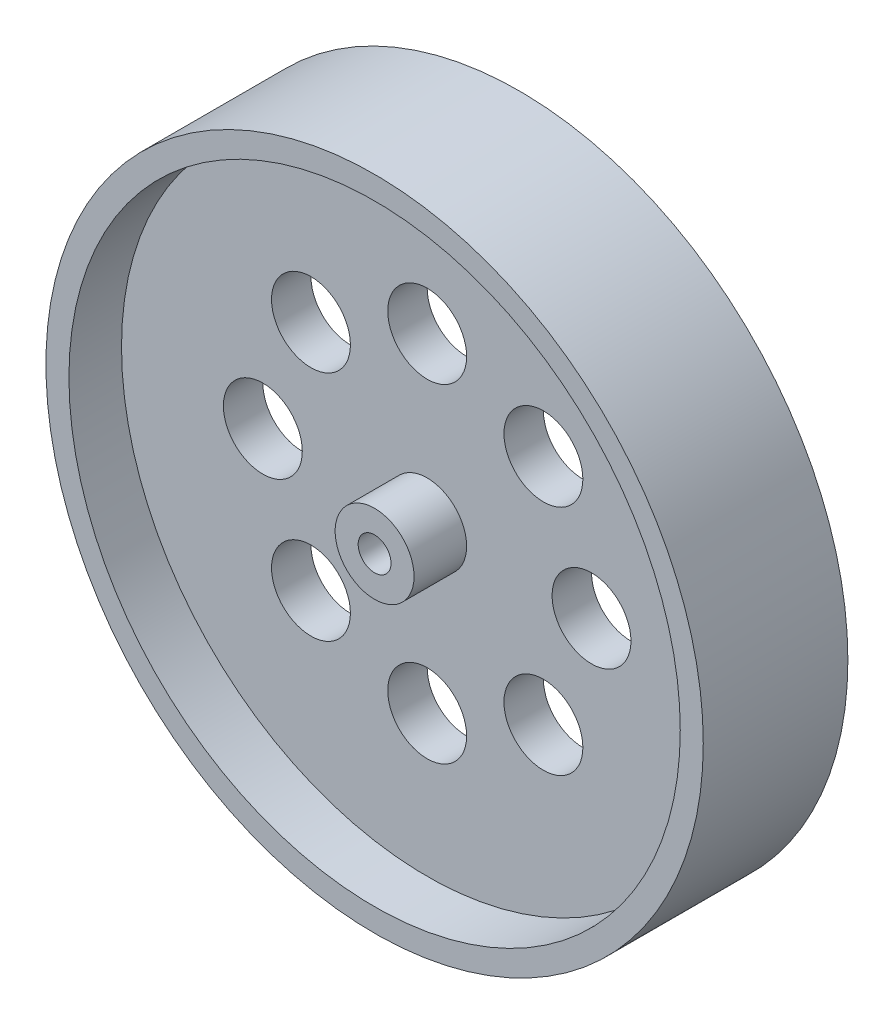
ISO-10303-21;
HEADER;
FILE_DESCRIPTION(('STEP AP214'),'2;1');
FILE_NAME('part.step','',(''),(''),'','','');
FILE_SCHEMA(('AUTOMOTIVE_DESIGN { 1 0 10303 214 1 1 1 1 }'));
ENDSEC;
DATA;
#1=APPLICATION_CONTEXT('core data for automotive mechanical design processes');
#2=APPLICATION_PROTOCOL_DEFINITION('international standard','automotive_design',2000,#1);
#3=PRODUCT_CONTEXT('',#1,'mechanical');
#4=PRODUCT('Part','Part','',(#3));
#5=PRODUCT_RELATED_PRODUCT_CATEGORY('part','',(#4));
#6=PRODUCT_DEFINITION_FORMATION('','',#4);
#7=PRODUCT_DEFINITION_CONTEXT('part definition',#1,'design');
#8=PRODUCT_DEFINITION('design','',#6,#7);
#9=PRODUCT_DEFINITION_SHAPE('','',#8);
#10=(LENGTH_UNIT() NAMED_UNIT(*) SI_UNIT(.MILLI.,.METRE.));
#11=(NAMED_UNIT(*) PLANE_ANGLE_UNIT() SI_UNIT($,.RADIAN.));
#12=(NAMED_UNIT(*) SI_UNIT($,.STERADIAN.) SOLID_ANGLE_UNIT());
#13=UNCERTAINTY_MEASURE_WITH_UNIT(LENGTH_MEASURE(1.E-05),#10,'distance_accuracy_value','');
#14=(GEOMETRIC_REPRESENTATION_CONTEXT(3) GLOBAL_UNCERTAINTY_ASSIGNED_CONTEXT((#13)) GLOBAL_UNIT_ASSIGNED_CONTEXT((#10,
#11,#12)) REPRESENTATION_CONTEXT('',''));
#15=CARTESIAN_POINT('',(0.,0.,0.));
#16=DIRECTION('',(0.,0.,1.));
#17=DIRECTION('',(1.,0.,0.));
#18=AXIS2_PLACEMENT_3D('',#15,#16,#17);
#19=CARTESIAN_POINT('',(0.,0.,22.));
#20=DIRECTION('',(0.,0.,1.));
#21=DIRECTION('',(1.,0.,0.));
#22=AXIS2_PLACEMENT_3D('',#19,#20,#21);
#23=PLANE('',#22);
#24=CARTESIAN_POINT('',(0.,0.,22.));
#25=DIRECTION('',(0.,0.,1.));
#26=DIRECTION('',(1.,0.,0.));
#27=AXIS2_PLACEMENT_3D('',#24,#25,#26);
#28=CIRCLE('',#27,2.5);
#29=CARTESIAN_POINT('',(2.5,0.,22.));
#30=VERTEX_POINT('',#29);
#31=EDGE_CURVE('E67',#30,#30,#28,.T.);
#32=ORIENTED_EDGE('',*,*,#31,.F.);
#33=EDGE_LOOP('',(#32));
#34=FACE_BOUND('',#33,.T.);
#35=CARTESIAN_POINT('',(0.,0.,22.));
#36=DIRECTION('',(0.,0.,1.));
#37=DIRECTION('',(1.,0.,0.));
#38=AXIS2_PLACEMENT_3D('',#35,#36,#37);
#39=CIRCLE('',#38,6.);
#40=CARTESIAN_POINT('',(6.,0.,22.));
#41=VERTEX_POINT('',#40);
#42=EDGE_CURVE('E95',#41,#41,#39,.T.);
#43=ORIENTED_EDGE('',*,*,#42,.T.);
#44=EDGE_LOOP('',(#43));
#45=FACE_BOUND('',#44,.T.);
#46=ADVANCED_FACE('F33',(#34,#45),#23,.T.);
#47=CARTESIAN_POINT('',(0.,0.,0.));
#48=DIRECTION('',(0.,0.,1.));
#49=DIRECTION('',(1.,0.,0.));
#50=AXIS2_PLACEMENT_3D('',#47,#48,#49);
#51=PLANE('',#50);
#52=CARTESIAN_POINT('',(0.,0.,0.));
#53=DIRECTION('',(0.,0.,-1.));
#54=DIRECTION('',(-1.,0.,0.));
#55=AXIS2_PLACEMENT_3D('',#52,#53,#54);
#56=CIRCLE('',#55,2.5);
#57=CARTESIAN_POINT('',(2.49633716473437,-0.135280301470544,0.));
#58=VERTEX_POINT('',#57);
#59=CARTESIAN_POINT('',(1.86981729687922,1.65945270384283,0.));
#60=VERTEX_POINT('',#59);
#61=EDGE_CURVE('E70',#58,#60,#56,.T.);
#62=ORIENTED_EDGE('',*,*,#61,.F.);
#63=DIRECTION('',(0.329583291868416,-0.944126503028688,0.));
#64=VECTOR('',#63,1.);
#65=CARTESIAN_POINT('',(2.1830772308068,0.762086201186142,0.));
#66=LINE('',#65,#64);
#67=EDGE_CURVE('E55',#60,#58,#66,.T.);
#68=ORIENTED_EDGE('',*,*,#67,.F.);
#69=EDGE_LOOP('',(#62,#68));
#70=FACE_BOUND('',#69,.T.);
#71=CARTESIAN_POINT('',(0.,0.,0.));
#72=DIRECTION('',(0.,0.,-1.));
#73=DIRECTION('',(-1.,0.,0.));
#74=AXIS2_PLACEMENT_3D('',#71,#72,#73);
#75=CIRCLE('',#74,6.);
#76=CARTESIAN_POINT('',(-6.,0.,0.));
#77=VERTEX_POINT('',#76);
#78=EDGE_CURVE('E150',#77,#77,#75,.T.);
#79=ORIENTED_EDGE('',*,*,#78,.T.);
#80=EDGE_LOOP('',(#79));
#81=FACE_BOUND('',#80,.T.);
#82=ADVANCED_FACE('F75',(#70,#81),#51,.F.);
#83=CARTESIAN_POINT('',(0.,0.,15.));
#84=DIRECTION('',(0.,0.,1.));
#85=DIRECTION('',(1.,0.,0.));
#86=AXIS2_PLACEMENT_3D('',#83,#84,#85);
#87=PLANE('',#86);
#88=CARTESIAN_POINT('',(0.,0.,15.));
#89=DIRECTION('',(0.,0.,1.));
#90=DIRECTION('',(1.,0.,0.));
#91=AXIS2_PLACEMENT_3D('',#88,#89,#90);
#92=CIRCLE('',#91,2.5);
#93=CARTESIAN_POINT('',(2.49633716473437,-0.135280301470545,15.));
#94=VERTEX_POINT('',#93);
#95=CARTESIAN_POINT('',(1.86981729687922,1.65945270384283,15.));
#96=VERTEX_POINT('',#95);
#97=EDGE_CURVE('E86',#94,#96,#92,.T.);
#98=ORIENTED_EDGE('',*,*,#97,.T.);
#99=DIRECTION('',(0.329583291868416,-0.944126503028688,0.));
#100=VECTOR('',#99,1.);
#101=CARTESIAN_POINT('',(2.1830772308068,0.762086201186142,15.));
#102=LINE('',#101,#100);
#103=EDGE_CURVE('E63',#96,#94,#102,.T.);
#104=ORIENTED_EDGE('',*,*,#103,.T.);
#105=EDGE_LOOP('',(#98,#104));
#106=FACE_BOUND('',#105,.T.);
#107=ADVANCED_FACE('F169',(#106),#87,.T.);
#108=CARTESIAN_POINT('',(0.,0.,22.));
#109=DIRECTION('',(0.,0.,-1.));
#110=DIRECTION('',(-1.,0.,0.));
#111=AXIS2_PLACEMENT_3D('',#108,#109,#110);
#112=CYLINDRICAL_SURFACE('',#111,50.);
#113=CARTESIAN_POINT('',(0.,0.,22.));
#114=DIRECTION('',(0.,0.,1.));
#115=DIRECTION('',(1.,0.,0.));
#116=AXIS2_PLACEMENT_3D('',#113,#114,#115);
#117=CIRCLE('',#116,50.);
#118=CARTESIAN_POINT('',(50.,0.,22.));
#119=VERTEX_POINT('',#118);
#120=EDGE_CURVE('E11',#119,#119,#117,.T.);
#121=ORIENTED_EDGE('',*,*,#120,.F.);
#122=EDGE_LOOP('',(#121));
#123=FACE_BOUND('',#122,.T.);
#124=CARTESIAN_POINT('',(0.,0.,0.));
#125=DIRECTION('',(0.,0.,1.));
#126=DIRECTION('',(1.,0.,0.));
#127=AXIS2_PLACEMENT_3D('',#124,#125,#126);
#128=CIRCLE('',#127,50.);
#129=CARTESIAN_POINT('',(50.,0.,0.));
#130=VERTEX_POINT('',#129);
#131=EDGE_CURVE('E42',#130,#130,#128,.T.);
#132=ORIENTED_EDGE('',*,*,#131,.T.);
#133=EDGE_LOOP('',(#132));
#134=FACE_BOUND('',#133,.T.);
#135=ADVANCED_FACE('F35',(#123,#134),#112,.T.);
#136=CARTESIAN_POINT('',(0.,0.,22.));
#137=DIRECTION('',(0.,0.,1.));
#138=DIRECTION('',(1.,0.,0.));
#139=AXIS2_PLACEMENT_3D('',#136,#137,#138);
#140=CIRCLE('',#139,46.5);
#141=CARTESIAN_POINT('',(46.5,0.,22.));
#142=VERTEX_POINT('',#141);
#143=EDGE_CURVE('E144',#142,#142,#140,.T.);
#144=ORIENTED_EDGE('',*,*,#143,.F.);
#145=EDGE_LOOP('',(#144));
#146=FACE_BOUND('',#145,.T.);
#147=ORIENTED_EDGE('',*,*,#120,.T.);
#148=EDGE_LOOP('',(#147));
#149=FACE_BOUND('',#148,.T.);
#150=ADVANCED_FACE('F165',(#146,#149),#23,.T.);
#151=CARTESIAN_POINT('',(0.,0.,0.));
#152=DIRECTION('',(0.,0.,-1.));
#153=DIRECTION('',(-1.,0.,0.));
#154=AXIS2_PLACEMENT_3D('',#151,#152,#153);
#155=CIRCLE('',#154,46.5);
#156=CARTESIAN_POINT('',(-46.5,0.,0.));
#157=VERTEX_POINT('',#156);
#158=EDGE_CURVE('E80',#157,#157,#155,.T.);
#159=ORIENTED_EDGE('',*,*,#158,.F.);
#160=EDGE_LOOP('',(#159));
#161=FACE_BOUND('',#160,.T.);
#162=ORIENTED_EDGE('',*,*,#131,.F.);
#163=EDGE_LOOP('',(#162));
#164=FACE_BOUND('',#163,.T.);
#165=ADVANCED_FACE('F162',(#161,#164),#51,.F.);
#166=CARTESIAN_POINT('',(0.,0.,15.));
#167=DIRECTION('',(0.,0.,1.));
#168=DIRECTION('',(1.,0.,0.));
#169=AXIS2_PLACEMENT_3D('',#166,#167,#168);
#170=CYLINDRICAL_SURFACE('',#169,2.5);
#171=ORIENTED_EDGE('',*,*,#97,.F.);
#172=DIRECTION('',(0.,0.,-1.));
#173=VECTOR('',#172,1.);
#174=CARTESIAN_POINT('',(2.49633716473437,-0.135280301470544,15.));
#175=LINE('',#174,#173);
#176=EDGE_CURVE('E50',#94,#58,#175,.T.);
#177=ORIENTED_EDGE('',*,*,#176,.T.);
#178=ORIENTED_EDGE('',*,*,#61,.T.);
#179=DIRECTION('',(0.,0.,-1.));
#180=VECTOR('',#179,1.);
#181=CARTESIAN_POINT('',(1.86981729687922,1.65945270384283,15.));
#182=LINE('',#181,#180);
#183=EDGE_CURVE('E60',#96,#60,#182,.T.);
#184=ORIENTED_EDGE('',*,*,#183,.F.);
#185=EDGE_LOOP('',(#171,#177,#178,#184));
#186=FACE_BOUND('',#185,.T.);
#187=ORIENTED_EDGE('',*,*,#31,.T.);
#188=EDGE_LOOP('',(#187));
#189=FACE_BOUND('',#188,.T.);
#190=ADVANCED_FACE('F71',(#186,#189),#170,.F.);
#191=CARTESIAN_POINT('',(2.1830772308068,0.762086201186142,15.));
#192=DIRECTION('',(0.944126503028688,0.329583291868416,0.));
#193=DIRECTION('',(-0.329583291868416,0.944126503028688,0.));
#194=AXIS2_PLACEMENT_3D('',#191,#192,#193);
#195=PLANE('',#194);
#196=ORIENTED_EDGE('',*,*,#67,.T.);
#197=ORIENTED_EDGE('',*,*,#176,.F.);
#198=ORIENTED_EDGE('',*,*,#103,.F.);
#199=ORIENTED_EDGE('',*,*,#183,.T.);
#200=EDGE_LOOP('',(#196,#197,#198,#199));
#201=FACE_BOUND('',#200,.T.);
#202=ADVANCED_FACE('F62',(#201),#195,.F.);
#203=CARTESIAN_POINT('',(0.,0.,8.));
#204=DIRECTION('',(0.,0.,-1.));
#205=DIRECTION('',(-1.,0.,0.));
#206=AXIS2_PLACEMENT_3D('',#203,#204,#205);
#207=CYLINDRICAL_SURFACE('',#206,46.5);
#208=CARTESIAN_POINT('',(0.,0.,8.));
#209=DIRECTION('',(0.,0.,-1.));
#210=DIRECTION('',(-1.,0.,0.));
#211=AXIS2_PLACEMENT_3D('',#208,#209,#210);
#212=CIRCLE('',#211,46.5);
#213=CARTESIAN_POINT('',(-46.5,0.,8.));
#214=VERTEX_POINT('',#213);
#215=EDGE_CURVE('E77',#214,#214,#212,.T.);
#216=ORIENTED_EDGE('',*,*,#215,.F.);
#217=EDGE_LOOP('',(#216));
#218=FACE_BOUND('',#217,.T.);
#219=ORIENTED_EDGE('',*,*,#158,.T.);
#220=EDGE_LOOP('',(#219));
#221=FACE_BOUND('',#220,.T.);
#222=ADVANCED_FACE('F160',(#218,#221),#207,.F.);
#223=CARTESIAN_POINT('',(0.,0.,8.));
#224=DIRECTION('',(0.,0.,-1.));
#225=DIRECTION('',(-1.,0.,0.));
#226=AXIS2_PLACEMENT_3D('',#223,#224,#225);
#227=PLANE('',#226);
#228=CARTESIAN_POINT('',(-17.68,-17.68,8.));
#229=DIRECTION('',(0.,0.,-1.));
#230=DIRECTION('',(-1.,0.,0.));
#231=AXIS2_PLACEMENT_3D('',#228,#229,#230);
#232=CIRCLE('',#231,6.);
#233=CARTESIAN_POINT('',(-23.68,-17.68,8.));
#234=VERTEX_POINT('',#233);
#235=EDGE_CURVE('E128',#234,#234,#232,.T.);
#236=ORIENTED_EDGE('',*,*,#235,.F.);
#237=EDGE_LOOP('',(#236));
#238=FACE_BOUND('',#237,.T.);
#239=CARTESIAN_POINT('',(17.68,-17.68,8.));
#240=DIRECTION('',(0.,0.,-1.));
#241=DIRECTION('',(-1.,0.,0.));
#242=AXIS2_PLACEMENT_3D('',#239,#240,#241);
#243=CIRCLE('',#242,6.);
#244=CARTESIAN_POINT('',(11.68,-17.68,8.));
#245=VERTEX_POINT('',#244);
#246=EDGE_CURVE('E118',#245,#245,#243,.T.);
#247=ORIENTED_EDGE('',*,*,#246,.F.);
#248=EDGE_LOOP('',(#247));
#249=FACE_BOUND('',#248,.T.);
#250=CARTESIAN_POINT('',(-17.68,17.68,8.));
#251=DIRECTION('',(0.,0.,-1.));
#252=DIRECTION('',(-1.,0.,0.));
#253=AXIS2_PLACEMENT_3D('',#250,#251,#252);
#254=CIRCLE('',#253,6.);
#255=CARTESIAN_POINT('',(-23.68,17.68,8.));
#256=VERTEX_POINT('',#255);
#257=EDGE_CURVE('E115',#256,#256,#254,.T.);
#258=ORIENTED_EDGE('',*,*,#257,.F.);
#259=EDGE_LOOP('',(#258));
#260=FACE_BOUND('',#259,.T.);
#261=CARTESIAN_POINT('',(17.68,17.68,8.));
#262=DIRECTION('',(0.,0.,-1.));
#263=DIRECTION('',(-1.,0.,0.));
#264=AXIS2_PLACEMENT_3D('',#261,#262,#263);
#265=CIRCLE('',#264,6.);
#266=CARTESIAN_POINT('',(11.68,17.68,8.));
#267=VERTEX_POINT('',#266);
#268=EDGE_CURVE('E112',#267,#267,#265,.T.);
#269=ORIENTED_EDGE('',*,*,#268,.F.);
#270=EDGE_LOOP('',(#269));
#271=FACE_BOUND('',#270,.T.);
#272=CARTESIAN_POINT('',(0.,-25.,8.));
#273=DIRECTION('',(0.,0.,-1.));
#274=DIRECTION('',(-1.,0.,0.));
#275=AXIS2_PLACEMENT_3D('',#272,#273,#274);
#276=CIRCLE('',#275,6.);
#277=CARTESIAN_POINT('',(-6.,-25.,8.));
#278=VERTEX_POINT('',#277);
#279=EDGE_CURVE('E108',#278,#278,#276,.T.);
#280=ORIENTED_EDGE('',*,*,#279,.F.);
#281=EDGE_LOOP('',(#280));
#282=FACE_BOUND('',#281,.T.);
#283=CARTESIAN_POINT('',(-25.,0.,8.));
#284=DIRECTION('',(0.,0.,-1.));
#285=DIRECTION('',(-1.,0.,0.));
#286=AXIS2_PLACEMENT_3D('',#283,#284,#285);
#287=CIRCLE('',#286,6.);
#288=CARTESIAN_POINT('',(-31.,0.,8.));
#289=VERTEX_POINT('',#288);
#290=EDGE_CURVE('E104',#289,#289,#287,.T.);
#291=ORIENTED_EDGE('',*,*,#290,.F.);
#292=EDGE_LOOP('',(#291));
#293=FACE_BOUND('',#292,.T.);
#294=CARTESIAN_POINT('',(0.,25.,8.));
#295=DIRECTION('',(0.,0.,-1.));
#296=DIRECTION('',(-1.,0.,0.));
#297=AXIS2_PLACEMENT_3D('',#294,#295,#296);
#298=CIRCLE('',#297,6.);
#299=CARTESIAN_POINT('',(-6.,25.,8.));
#300=VERTEX_POINT('',#299);
#301=EDGE_CURVE('E100',#300,#300,#298,.T.);
#302=ORIENTED_EDGE('',*,*,#301,.F.);
#303=EDGE_LOOP('',(#302));
#304=FACE_BOUND('',#303,.T.);
#305=CARTESIAN_POINT('',(25.,0.,8.));
#306=DIRECTION('',(0.,0.,-1.));
#307=DIRECTION('',(-1.,0.,0.));
#308=AXIS2_PLACEMENT_3D('',#305,#306,#307);
#309=CIRCLE('',#308,6.);
#310=CARTESIAN_POINT('',(19.,0.,8.));
#311=VERTEX_POINT('',#310);
#312=EDGE_CURVE('E96',#311,#311,#309,.T.);
#313=ORIENTED_EDGE('',*,*,#312,.F.);
#314=EDGE_LOOP('',(#313));
#315=FACE_BOUND('',#314,.T.);
#316=CARTESIAN_POINT('',(0.,0.,8.));
#317=DIRECTION('',(0.,0.,-1.));
#318=DIRECTION('',(-1.,0.,0.));
#319=AXIS2_PLACEMENT_3D('',#316,#317,#318);
#320=CIRCLE('',#319,6.);
#321=CARTESIAN_POINT('',(-6.,0.,8.));
#322=VERTEX_POINT('',#321);
#323=EDGE_CURVE('E153',#322,#322,#320,.T.);
#324=ORIENTED_EDGE('',*,*,#323,.F.);
#325=EDGE_LOOP('',(#324));
#326=FACE_BOUND('',#325,.T.);
#327=ORIENTED_EDGE('',*,*,#215,.T.);
#328=EDGE_LOOP('',(#327));
#329=FACE_BOUND('',#328,.T.);
#330=ADVANCED_FACE('F194',(#238,#249,#260,#271,#282,#293,#304,#315,#326,#329),#227,.T.);
#331=CARTESIAN_POINT('',(0.,0.,8.));
#332=DIRECTION('',(0.,0.,-1.));
#333=DIRECTION('',(-1.,0.,0.));
#334=AXIS2_PLACEMENT_3D('',#331,#332,#333);
#335=CYLINDRICAL_SURFACE('',#334,6.);
#336=ORIENTED_EDGE('',*,*,#323,.T.);
#337=EDGE_LOOP('',(#336));
#338=FACE_BOUND('',#337,.T.);
#339=ORIENTED_EDGE('',*,*,#78,.F.);
#340=EDGE_LOOP('',(#339));
#341=FACE_BOUND('',#340,.T.);
#342=ADVANCED_FACE('F198',(#338,#341),#335,.T.);
#343=CARTESIAN_POINT('',(0.,0.,14.));
#344=DIRECTION('',(0.,0.,1.));
#345=DIRECTION('',(1.,0.,0.));
#346=AXIS2_PLACEMENT_3D('',#343,#344,#345);
#347=CYLINDRICAL_SURFACE('',#346,46.5);
#348=CARTESIAN_POINT('',(0.,0.,14.));
#349=DIRECTION('',(0.,0.,1.));
#350=DIRECTION('',(1.,0.,0.));
#351=AXIS2_PLACEMENT_3D('',#348,#349,#350);
#352=CIRCLE('',#351,46.5);
#353=CARTESIAN_POINT('',(46.5,0.,14.));
#354=VERTEX_POINT('',#353);
#355=EDGE_CURVE('E147',#354,#354,#352,.T.);
#356=ORIENTED_EDGE('',*,*,#355,.F.);
#357=EDGE_LOOP('',(#356));
#358=FACE_BOUND('',#357,.T.);
#359=ORIENTED_EDGE('',*,*,#143,.T.);
#360=EDGE_LOOP('',(#359));
#361=FACE_BOUND('',#360,.T.);
#362=ADVANCED_FACE('F202',(#358,#361),#347,.F.);
#363=CARTESIAN_POINT('',(0.,0.,14.));
#364=DIRECTION('',(0.,0.,1.));
#365=DIRECTION('',(1.,0.,0.));
#366=AXIS2_PLACEMENT_3D('',#363,#364,#365);
#367=PLANE('',#366);
#368=CARTESIAN_POINT('',(-17.68,-17.68,14.));
#369=DIRECTION('',(0.,0.,1.));
#370=DIRECTION('',(1.,0.,0.));
#371=AXIS2_PLACEMENT_3D('',#368,#369,#370);
#372=CIRCLE('',#371,6.);
#373=CARTESIAN_POINT('',(-11.68,-17.68,14.));
#374=VERTEX_POINT('',#373);
#375=EDGE_CURVE('E37',#374,#374,#372,.T.);
#376=ORIENTED_EDGE('',*,*,#375,.F.);
#377=EDGE_LOOP('',(#376));
#378=FACE_BOUND('',#377,.T.);
#379=CARTESIAN_POINT('',(17.68,-17.68,14.));
#380=DIRECTION('',(0.,0.,1.));
#381=DIRECTION('',(1.,0.,0.));
#382=AXIS2_PLACEMENT_3D('',#379,#380,#381);
#383=CIRCLE('',#382,6.);
#384=CARTESIAN_POINT('',(23.68,-17.68,14.));
#385=VERTEX_POINT('',#384);
#386=EDGE_CURVE('E116',#385,#385,#383,.T.);
#387=ORIENTED_EDGE('',*,*,#386,.F.);
#388=EDGE_LOOP('',(#387));
#389=FACE_BOUND('',#388,.T.);
#390=CARTESIAN_POINT('',(-17.68,17.68,14.));
#391=DIRECTION('',(0.,0.,1.));
#392=DIRECTION('',(1.,0.,0.));
#393=AXIS2_PLACEMENT_3D('',#390,#391,#392);
#394=CIRCLE('',#393,6.);
#395=CARTESIAN_POINT('',(-11.68,17.68,14.));
#396=VERTEX_POINT('',#395);
#397=EDGE_CURVE('E113',#396,#396,#394,.T.);
#398=ORIENTED_EDGE('',*,*,#397,.F.);
#399=EDGE_LOOP('',(#398));
#400=FACE_BOUND('',#399,.T.);
#401=CARTESIAN_POINT('',(17.68,17.68,14.));
#402=DIRECTION('',(0.,0.,1.));
#403=DIRECTION('',(1.,0.,0.));
#404=AXIS2_PLACEMENT_3D('',#401,#402,#403);
#405=CIRCLE('',#404,6.);
#406=CARTESIAN_POINT('',(23.68,17.68,14.));
#407=VERTEX_POINT('',#406);
#408=EDGE_CURVE('E109',#407,#407,#405,.T.);
#409=ORIENTED_EDGE('',*,*,#408,.F.);
#410=EDGE_LOOP('',(#409));
#411=FACE_BOUND('',#410,.T.);
#412=CARTESIAN_POINT('',(0.,-25.,14.));
#413=DIRECTION('',(0.,0.,1.));
#414=DIRECTION('',(1.,0.,0.));
#415=AXIS2_PLACEMENT_3D('',#412,#413,#414);
#416=CIRCLE('',#415,6.);
#417=CARTESIAN_POINT('',(6.,-25.,14.));
#418=VERTEX_POINT('',#417);
#419=EDGE_CURVE('E105',#418,#418,#416,.T.);
#420=ORIENTED_EDGE('',*,*,#419,.F.);
#421=EDGE_LOOP('',(#420));
#422=FACE_BOUND('',#421,.T.);
#423=CARTESIAN_POINT('',(-25.,0.,14.));
#424=DIRECTION('',(0.,0.,1.));
#425=DIRECTION('',(1.,0.,0.));
#426=AXIS2_PLACEMENT_3D('',#423,#424,#425);
#427=CIRCLE('',#426,6.);
#428=CARTESIAN_POINT('',(-19.,0.,14.));
#429=VERTEX_POINT('',#428);
#430=EDGE_CURVE('E101',#429,#429,#427,.T.);
#431=ORIENTED_EDGE('',*,*,#430,.F.);
#432=EDGE_LOOP('',(#431));
#433=FACE_BOUND('',#432,.T.);
#434=CARTESIAN_POINT('',(0.,25.,14.));
#435=DIRECTION('',(0.,0.,1.));
#436=DIRECTION('',(1.,0.,0.));
#437=AXIS2_PLACEMENT_3D('',#434,#435,#436);
#438=CIRCLE('',#437,6.);
#439=CARTESIAN_POINT('',(6.,25.,14.));
#440=VERTEX_POINT('',#439);
#441=EDGE_CURVE('E97',#440,#440,#438,.T.);
#442=ORIENTED_EDGE('',*,*,#441,.F.);
#443=EDGE_LOOP('',(#442));
#444=FACE_BOUND('',#443,.T.);
#445=CARTESIAN_POINT('',(25.,0.,14.));
#446=DIRECTION('',(0.,0.,1.));
#447=DIRECTION('',(1.,0.,0.));
#448=AXIS2_PLACEMENT_3D('',#445,#446,#447);
#449=CIRCLE('',#448,6.);
#450=CARTESIAN_POINT('',(31.,0.,14.));
#451=VERTEX_POINT('',#450);
#452=EDGE_CURVE('E92',#451,#451,#449,.T.);
#453=ORIENTED_EDGE('',*,*,#452,.F.);
#454=EDGE_LOOP('',(#453));
#455=FACE_BOUND('',#454,.T.);
#456=CARTESIAN_POINT('',(0.,0.,14.));
#457=DIRECTION('',(0.,0.,1.));
#458=DIRECTION('',(1.,0.,0.));
#459=AXIS2_PLACEMENT_3D('',#456,#457,#458);
#460=CIRCLE('',#459,6.);
#461=CARTESIAN_POINT('',(6.,0.,14.));
#462=VERTEX_POINT('',#461);
#463=EDGE_CURVE('E141',#462,#462,#460,.T.);
#464=ORIENTED_EDGE('',*,*,#463,.F.);
#465=EDGE_LOOP('',(#464));
#466=FACE_BOUND('',#465,.T.);
#467=ORIENTED_EDGE('',*,*,#355,.T.);
#468=EDGE_LOOP('',(#467));
#469=FACE_BOUND('',#468,.T.);
#470=ADVANCED_FACE('F206',(#378,#389,#400,#411,#422,#433,#444,#455,#466,#469),#367,.T.);
#471=CARTESIAN_POINT('',(0.,0.,14.));
#472=DIRECTION('',(0.,0.,1.));
#473=DIRECTION('',(1.,0.,0.));
#474=AXIS2_PLACEMENT_3D('',#471,#472,#473);
#475=CYLINDRICAL_SURFACE('',#474,6.);
#476=ORIENTED_EDGE('',*,*,#463,.T.);
#477=EDGE_LOOP('',(#476));
#478=FACE_BOUND('',#477,.T.);
#479=ORIENTED_EDGE('',*,*,#42,.F.);
#480=EDGE_LOOP('',(#479));
#481=FACE_BOUND('',#480,.T.);
#482=ADVANCED_FACE('F210',(#478,#481),#475,.T.);
#483=CARTESIAN_POINT('',(25.,0.,16.));
#484=DIRECTION('',(0.,0.,-1.));
#485=DIRECTION('',(-1.,0.,0.));
#486=AXIS2_PLACEMENT_3D('',#483,#484,#485);
#487=CYLINDRICAL_SURFACE('',#486,6.);
#488=ORIENTED_EDGE('',*,*,#452,.T.);
#489=EDGE_LOOP('',(#488));
#490=FACE_BOUND('',#489,.T.);
#491=ORIENTED_EDGE('',*,*,#312,.T.);
#492=EDGE_LOOP('',(#491));
#493=FACE_BOUND('',#492,.T.);
#494=ADVANCED_FACE('F214',(#490,#493),#487,.F.);
#495=CARTESIAN_POINT('',(0.,25.,16.));
#496=DIRECTION('',(0.,0.,-1.));
#497=DIRECTION('',(-1.,0.,0.));
#498=AXIS2_PLACEMENT_3D('',#495,#496,#497);
#499=CYLINDRICAL_SURFACE('',#498,6.);
#500=ORIENTED_EDGE('',*,*,#441,.T.);
#501=EDGE_LOOP('',(#500));
#502=FACE_BOUND('',#501,.T.);
#503=ORIENTED_EDGE('',*,*,#301,.T.);
#504=EDGE_LOOP('',(#503));
#505=FACE_BOUND('',#504,.T.);
#506=ADVANCED_FACE('F218',(#502,#505),#499,.F.);
#507=CARTESIAN_POINT('',(-25.,0.,16.));
#508=DIRECTION('',(0.,0.,-1.));
#509=DIRECTION('',(-1.,0.,0.));
#510=AXIS2_PLACEMENT_3D('',#507,#508,#509);
#511=CYLINDRICAL_SURFACE('',#510,6.);
#512=ORIENTED_EDGE('',*,*,#430,.T.);
#513=EDGE_LOOP('',(#512));
#514=FACE_BOUND('',#513,.T.);
#515=ORIENTED_EDGE('',*,*,#290,.T.);
#516=EDGE_LOOP('',(#515));
#517=FACE_BOUND('',#516,.T.);
#518=ADVANCED_FACE('F222',(#514,#517),#511,.F.);
#519=CARTESIAN_POINT('',(0.,-25.,16.));
#520=DIRECTION('',(0.,0.,-1.));
#521=DIRECTION('',(-1.,0.,0.));
#522=AXIS2_PLACEMENT_3D('',#519,#520,#521);
#523=CYLINDRICAL_SURFACE('',#522,6.);
#524=ORIENTED_EDGE('',*,*,#419,.T.);
#525=EDGE_LOOP('',(#524));
#526=FACE_BOUND('',#525,.T.);
#527=ORIENTED_EDGE('',*,*,#279,.T.);
#528=EDGE_LOOP('',(#527));
#529=FACE_BOUND('',#528,.T.);
#530=ADVANCED_FACE('F226',(#526,#529),#523,.F.);
#531=CARTESIAN_POINT('',(17.68,17.68,16.));
#532=DIRECTION('',(0.,0.,-1.));
#533=DIRECTION('',(-1.,0.,0.));
#534=AXIS2_PLACEMENT_3D('',#531,#532,#533);
#535=CYLINDRICAL_SURFACE('',#534,6.);
#536=ORIENTED_EDGE('',*,*,#408,.T.);
#537=EDGE_LOOP('',(#536));
#538=FACE_BOUND('',#537,.T.);
#539=ORIENTED_EDGE('',*,*,#268,.T.);
#540=EDGE_LOOP('',(#539));
#541=FACE_BOUND('',#540,.T.);
#542=ADVANCED_FACE('F230',(#538,#541),#535,.F.);
#543=CARTESIAN_POINT('',(-17.68,17.68,16.));
#544=DIRECTION('',(0.,0.,-1.));
#545=DIRECTION('',(-1.,0.,0.));
#546=AXIS2_PLACEMENT_3D('',#543,#544,#545);
#547=CYLINDRICAL_SURFACE('',#546,6.);
#548=ORIENTED_EDGE('',*,*,#397,.T.);
#549=EDGE_LOOP('',(#548));
#550=FACE_BOUND('',#549,.T.);
#551=ORIENTED_EDGE('',*,*,#257,.T.);
#552=EDGE_LOOP('',(#551));
#553=FACE_BOUND('',#552,.T.);
#554=ADVANCED_FACE('F234',(#550,#553),#547,.F.);
#555=CARTESIAN_POINT('',(17.68,-17.68,16.));
#556=DIRECTION('',(0.,0.,-1.));
#557=DIRECTION('',(-1.,0.,0.));
#558=AXIS2_PLACEMENT_3D('',#555,#556,#557);
#559=CYLINDRICAL_SURFACE('',#558,6.);
#560=ORIENTED_EDGE('',*,*,#386,.T.);
#561=EDGE_LOOP('',(#560));
#562=FACE_BOUND('',#561,.T.);
#563=ORIENTED_EDGE('',*,*,#246,.T.);
#564=EDGE_LOOP('',(#563));
#565=FACE_BOUND('',#564,.T.);
#566=ADVANCED_FACE('F238',(#562,#565),#559,.F.);
#567=CARTESIAN_POINT('',(-17.68,-17.68,16.));
#568=DIRECTION('',(0.,0.,-1.));
#569=DIRECTION('',(-1.,0.,0.));
#570=AXIS2_PLACEMENT_3D('',#567,#568,#569);
#571=CYLINDRICAL_SURFACE('',#570,6.);
#572=ORIENTED_EDGE('',*,*,#375,.T.);
#573=EDGE_LOOP('',(#572));
#574=FACE_BOUND('',#573,.T.);
#575=ORIENTED_EDGE('',*,*,#235,.T.);
#576=EDGE_LOOP('',(#575));
#577=FACE_BOUND('',#576,.T.);
#578=ADVANCED_FACE('F242',(#574,#577),#571,.F.);
#579=CLOSED_SHELL('',(#46,#82,#107,#135,#150,#165,#190,#202,#222,#330,#342,#362,#470,#482,#494,
#506,#518,#530,#542,#554,#566,#578));
#580=MANIFOLD_SOLID_BREP('B2',#579);
#581=ADVANCED_BREP_SHAPE_REPRESENTATION('',(#18,#580),#14);
#582=SHAPE_DEFINITION_REPRESENTATION(#9,#581);
ENDSEC;
END-ISO-10303-21;
